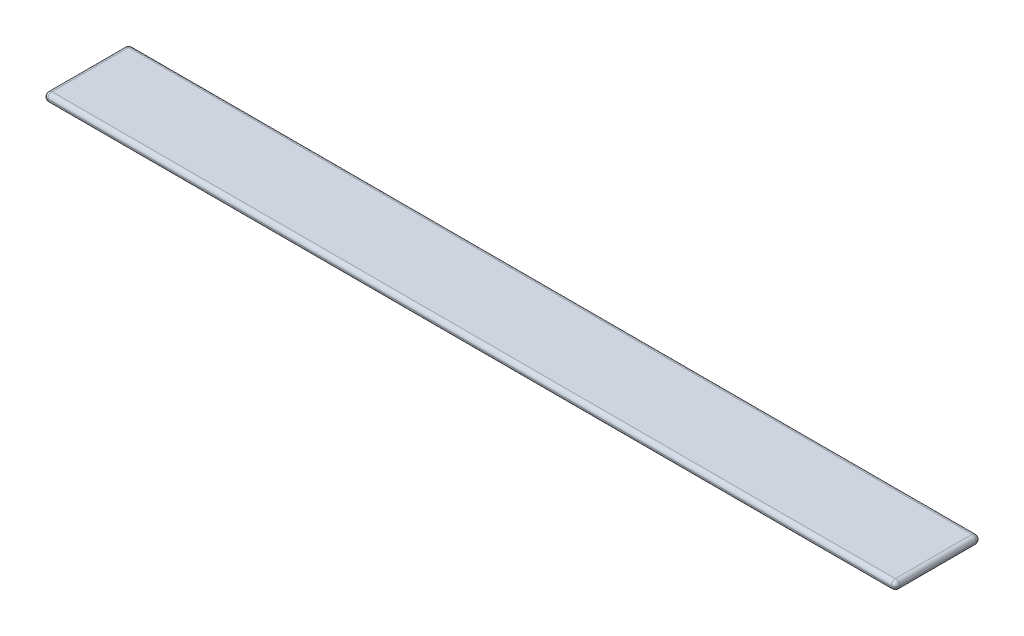
ISO-10303-21;
HEADER;
FILE_DESCRIPTION(('STEP AP214'),'2;1');
FILE_NAME('part.step','',(''),(''),'','','');
FILE_SCHEMA(('AUTOMOTIVE_DESIGN { 1 0 10303 214 1 1 1 1 }'));
ENDSEC;
DATA;
#1=APPLICATION_CONTEXT('core data for automotive mechanical design processes');
#2=APPLICATION_PROTOCOL_DEFINITION('international standard','automotive_design',2000,#1);
#3=PRODUCT_CONTEXT('',#1,'mechanical');
#4=PRODUCT('Part','Part','',(#3));
#5=PRODUCT_RELATED_PRODUCT_CATEGORY('part','',(#4));
#6=PRODUCT_DEFINITION_FORMATION('','',#4);
#7=PRODUCT_DEFINITION_CONTEXT('part definition',#1,'design');
#8=PRODUCT_DEFINITION('design','',#6,#7);
#9=PRODUCT_DEFINITION_SHAPE('','',#8);
#10=(LENGTH_UNIT() NAMED_UNIT(*) SI_UNIT(.MILLI.,.METRE.));
#11=(NAMED_UNIT(*) PLANE_ANGLE_UNIT() SI_UNIT($,.RADIAN.));
#12=(NAMED_UNIT(*) SI_UNIT($,.STERADIAN.) SOLID_ANGLE_UNIT());
#13=UNCERTAINTY_MEASURE_WITH_UNIT(LENGTH_MEASURE(1.E-05),#10,'distance_accuracy_value','');
#14=(GEOMETRIC_REPRESENTATION_CONTEXT(3) GLOBAL_UNCERTAINTY_ASSIGNED_CONTEXT((#13)) GLOBAL_UNIT_ASSIGNED_CONTEXT((#10,
#11,#12)) REPRESENTATION_CONTEXT('',''));
#15=CARTESIAN_POINT('',(0.,0.,0.));
#16=DIRECTION('',(0.,0.,1.));
#17=DIRECTION('',(1.,0.,0.));
#18=AXIS2_PLACEMENT_3D('',#15,#16,#17);
#19=CARTESIAN_POINT('',(0.,0.5,0.));
#20=DIRECTION('',(0.,1.,0.));
#21=DIRECTION('',(0.,0.,1.));
#22=AXIS2_PLACEMENT_3D('',#19,#20,#21);
#23=PLANE('',#22);
#24=DIRECTION('',(-1.,0.,0.));
#25=VECTOR('',#24,1.);
#26=CARTESIAN_POINT('',(0.,0.5,0.25));
#27=LINE('',#26,#25);
#28=CARTESIAN_POINT('',(49.75,0.5,0.25));
#29=VERTEX_POINT('',#28);
#30=CARTESIAN_POINT('',(0.25,0.5,0.25));
#31=VERTEX_POINT('',#30);
#32=EDGE_CURVE('E49',#29,#31,#27,.T.);
#33=ORIENTED_EDGE('',*,*,#32,.T.);
#34=DIRECTION('',(0.,0.,1.));
#35=VECTOR('',#34,1.);
#36=CARTESIAN_POINT('',(0.250000000000001,0.5,5.));
#37=LINE('',#36,#35);
#38=CARTESIAN_POINT('',(0.250000000000001,0.5,4.75));
#39=VERTEX_POINT('',#38);
#40=EDGE_CURVE('E11',#31,#39,#37,.T.);
#41=ORIENTED_EDGE('',*,*,#40,.T.);
#42=DIRECTION('',(1.,0.,0.));
#43=VECTOR('',#42,1.);
#44=CARTESIAN_POINT('',(50.,0.5,4.75));
#45=LINE('',#44,#43);
#46=CARTESIAN_POINT('',(49.75,0.5,4.75));
#47=VERTEX_POINT('',#46);
#48=EDGE_CURVE('E111',#39,#47,#45,.T.);
#49=ORIENTED_EDGE('',*,*,#48,.T.);
#50=DIRECTION('',(0.,0.,-1.));
#51=VECTOR('',#50,1.);
#52=CARTESIAN_POINT('',(49.75,0.5,0.));
#53=LINE('',#52,#51);
#54=EDGE_CURVE('E110',#47,#29,#53,.T.);
#55=ORIENTED_EDGE('',*,*,#54,.T.);
#56=EDGE_LOOP('',(#33,#41,#49,#55));
#57=FACE_BOUND('',#56,.T.);
#58=ADVANCED_FACE('F39',(#57),#23,.T.);
#59=CARTESIAN_POINT('',(0.,0.,0.));
#60=DIRECTION('',(0.,1.,0.));
#61=DIRECTION('',(0.,0.,1.));
#62=AXIS2_PLACEMENT_3D('',#59,#60,#61);
#63=PLANE('',#62);
#64=DIRECTION('',(1.,0.,0.));
#65=VECTOR('',#64,1.);
#66=CARTESIAN_POINT('',(0.,0.,4.75));
#67=LINE('',#66,#65);
#68=CARTESIAN_POINT('',(49.75,0.,4.75));
#69=VERTEX_POINT('',#68);
#70=CARTESIAN_POINT('',(0.250000000000001,0.,4.75));
#71=VERTEX_POINT('',#70);
#72=EDGE_CURVE('E173',#69,#71,#67,.F.);
#73=ORIENTED_EDGE('',*,*,#72,.T.);
#74=DIRECTION('',(0.,0.,1.));
#75=VECTOR('',#74,1.);
#76=CARTESIAN_POINT('',(0.25,0.,0.));
#77=LINE('',#76,#75);
#78=CARTESIAN_POINT('',(0.25,0.,0.25));
#79=VERTEX_POINT('',#78);
#80=EDGE_CURVE('E116',#71,#79,#77,.F.);
#81=ORIENTED_EDGE('',*,*,#80,.T.);
#82=DIRECTION('',(-1.,0.,0.));
#83=VECTOR('',#82,1.);
#84=CARTESIAN_POINT('',(0.,0.,0.25));
#85=LINE('',#84,#83);
#86=CARTESIAN_POINT('',(49.75,0.,0.25));
#87=VERTEX_POINT('',#86);
#88=EDGE_CURVE('E98',#79,#87,#85,.F.);
#89=ORIENTED_EDGE('',*,*,#88,.T.);
#90=DIRECTION('',(0.,0.,-1.));
#91=VECTOR('',#90,1.);
#92=CARTESIAN_POINT('',(49.75,0.,0.));
#93=LINE('',#92,#91);
#94=EDGE_CURVE('E172',#87,#69,#93,.F.);
#95=ORIENTED_EDGE('',*,*,#94,.T.);
#96=EDGE_LOOP('',(#73,#81,#89,#95));
#97=FACE_BOUND('',#96,.T.);
#98=ADVANCED_FACE('F215',(#97),#63,.F.);
#99=CARTESIAN_POINT('',(0.25,0.25,0.25));
#100=DIRECTION('',(-1.,0.,0.));
#101=DIRECTION('',(0.,0.,1.));
#102=AXIS2_PLACEMENT_3D('',#99,#100,#101);
#103=SPHERICAL_SURFACE('',#102,0.25);
#104=CARTESIAN_POINT('',(0.25,0.25,0.25));
#105=DIRECTION('',(-1.,0.,0.));
#106=DIRECTION('',(0.,0.,1.));
#107=AXIS2_PLACEMENT_3D('',#104,#105,#106);
#108=CIRCLE('',#107,0.25);
#109=CARTESIAN_POINT('',(0.25,0.25,0.));
#110=VERTEX_POINT('',#109);
#111=EDGE_CURVE('E125',#110,#31,#108,.F.);
#112=ORIENTED_EDGE('',*,*,#111,.F.);
#113=CARTESIAN_POINT('',(0.25,0.25,0.25));
#114=DIRECTION('',(0.,-1.,0.));
#115=DIRECTION('',(0.,0.,-1.));
#116=AXIS2_PLACEMENT_3D('',#113,#114,#115);
#117=CIRCLE('',#116,0.25);
#118=CARTESIAN_POINT('',(0.,0.25,0.25));
#119=VERTEX_POINT('',#118);
#120=EDGE_CURVE('E43',#119,#110,#117,.T.);
#121=ORIENTED_EDGE('',*,*,#120,.F.);
#122=CARTESIAN_POINT('',(0.25,0.25,0.25));
#123=DIRECTION('',(0.,0.,-1.));
#124=DIRECTION('',(-1.,0.,0.));
#125=AXIS2_PLACEMENT_3D('',#122,#123,#124);
#126=CIRCLE('',#125,0.25);
#127=EDGE_CURVE('E169',#31,#119,#126,.F.);
#128=ORIENTED_EDGE('',*,*,#127,.F.);
#129=EDGE_LOOP('',(#112,#121,#128));
#130=FACE_BOUND('',#129,.T.);
#131=ADVANCED_FACE('F41',(#130),#103,.T.);
#132=CARTESIAN_POINT('',(0.25,0.25,0.25));
#133=DIRECTION('',(0.,0.,-1.));
#134=DIRECTION('',(-1.,0.,0.));
#135=AXIS2_PLACEMENT_3D('',#132,#133,#134);
#136=SPHERICAL_SURFACE('',#135,0.25);
#137=CARTESIAN_POINT('',(0.25,0.25,0.25));
#138=DIRECTION('',(0.,0.,-1.));
#139=DIRECTION('',(-1.,0.,0.));
#140=AXIS2_PLACEMENT_3D('',#137,#138,#139);
#141=CIRCLE('',#140,0.25);
#142=EDGE_CURVE('E161',#119,#79,#141,.F.);
#143=ORIENTED_EDGE('',*,*,#142,.F.);
#144=ORIENTED_EDGE('',*,*,#120,.T.);
#145=CARTESIAN_POINT('',(0.25,0.25,0.25));
#146=DIRECTION('',(-1.,0.,0.));
#147=DIRECTION('',(0.,0.,1.));
#148=AXIS2_PLACEMENT_3D('',#145,#146,#147);
#149=CIRCLE('',#148,0.25);
#150=EDGE_CURVE('E164',#79,#110,#149,.F.);
#151=ORIENTED_EDGE('',*,*,#150,.F.);
#152=EDGE_LOOP('',(#143,#144,#151));
#153=FACE_BOUND('',#152,.T.);
#154=ADVANCED_FACE('F210',(#153),#136,.T.);
#155=CARTESIAN_POINT('',(0.25,0.25,0.));
#156=DIRECTION('',(0.,0.,-1.));
#157=DIRECTION('',(-1.,0.,0.));
#158=AXIS2_PLACEMENT_3D('',#155,#156,#157);
#159=CYLINDRICAL_SURFACE('',#158,0.25);
#160=ORIENTED_EDGE('',*,*,#40,.F.);
#161=ORIENTED_EDGE('',*,*,#127,.T.);
#162=DIRECTION('',(0.,0.,1.));
#163=VECTOR('',#162,1.);
#164=CARTESIAN_POINT('',(0.,0.25,0.));
#165=LINE('',#164,#163);
#166=CARTESIAN_POINT('',(0.,0.25,4.75));
#167=VERTEX_POINT('',#166);
#168=EDGE_CURVE('E158',#167,#119,#165,.F.);
#169=ORIENTED_EDGE('',*,*,#168,.F.);
#170=CARTESIAN_POINT('',(0.250000000000001,0.25,4.75));
#171=DIRECTION('',(0.,0.,1.));
#172=DIRECTION('',(1.,0.,0.));
#173=AXIS2_PLACEMENT_3D('',#170,#171,#172);
#174=CIRCLE('',#173,0.25);
#175=EDGE_CURVE('E133',#39,#167,#174,.T.);
#176=ORIENTED_EDGE('',*,*,#175,.F.);
#177=EDGE_LOOP('',(#160,#161,#169,#176));
#178=FACE_BOUND('',#177,.T.);
#179=ADVANCED_FACE('F233',(#178),#159,.T.);
#180=CARTESIAN_POINT('',(0.,0.25,0.25));
#181=DIRECTION('',(1.,0.,0.));
#182=DIRECTION('',(0.,0.,-1.));
#183=AXIS2_PLACEMENT_3D('',#180,#181,#182);
#184=CYLINDRICAL_SURFACE('',#183,0.25);
#185=CARTESIAN_POINT('',(49.75,0.25,0.25));
#186=DIRECTION('',(1.,0.,0.));
#187=DIRECTION('',(0.,0.,-1.));
#188=AXIS2_PLACEMENT_3D('',#185,#186,#187);
#189=CIRCLE('',#188,0.25);
#190=CARTESIAN_POINT('',(49.75,0.25,0.));
#191=VERTEX_POINT('',#190);
#192=EDGE_CURVE('E123',#191,#29,#189,.T.);
#193=ORIENTED_EDGE('',*,*,#192,.F.);
#194=DIRECTION('',(-1.,0.,0.));
#195=VECTOR('',#194,1.);
#196=CARTESIAN_POINT('',(50.,0.25,0.));
#197=LINE('',#196,#195);
#198=EDGE_CURVE('E167',#110,#191,#197,.F.);
#199=ORIENTED_EDGE('',*,*,#198,.F.);
#200=ORIENTED_EDGE('',*,*,#111,.T.);
#201=ORIENTED_EDGE('',*,*,#32,.F.);
#202=EDGE_LOOP('',(#193,#199,#200,#201));
#203=FACE_BOUND('',#202,.T.);
#204=ADVANCED_FACE('F121',(#203),#184,.T.);
#205=CARTESIAN_POINT('',(0.,0.25,0.25));
#206=DIRECTION('',(-1.,0.,0.));
#207=DIRECTION('',(0.,0.,1.));
#208=AXIS2_PLACEMENT_3D('',#205,#206,#207);
#209=CYLINDRICAL_SURFACE('',#208,0.25);
#210=ORIENTED_EDGE('',*,*,#150,.T.);
#211=ORIENTED_EDGE('',*,*,#198,.T.);
#212=CARTESIAN_POINT('',(49.75,0.25,0.25));
#213=DIRECTION('',(1.,0.,0.));
#214=DIRECTION('',(0.,0.,-1.));
#215=AXIS2_PLACEMENT_3D('',#212,#213,#214);
#216=CIRCLE('',#215,0.25);
#217=EDGE_CURVE('E152',#87,#191,#216,.T.);
#218=ORIENTED_EDGE('',*,*,#217,.F.);
#219=ORIENTED_EDGE('',*,*,#88,.F.);
#220=EDGE_LOOP('',(#210,#211,#218,#219));
#221=FACE_BOUND('',#220,.T.);
#222=ADVANCED_FACE('F209',(#221),#209,.T.);
#223=CARTESIAN_POINT('',(0.25,0.25,0.));
#224=DIRECTION('',(0.,0.,1.));
#225=DIRECTION('',(1.,0.,0.));
#226=AXIS2_PLACEMENT_3D('',#223,#224,#225);
#227=CYLINDRICAL_SURFACE('',#226,0.25);
#228=CARTESIAN_POINT('',(0.250000000000001,0.25,4.75));
#229=DIRECTION('',(0.,0.,1.));
#230=DIRECTION('',(1.,0.,0.));
#231=AXIS2_PLACEMENT_3D('',#228,#229,#230);
#232=CIRCLE('',#231,0.25);
#233=EDGE_CURVE('E149',#167,#71,#232,.T.);
#234=ORIENTED_EDGE('',*,*,#233,.F.);
#235=ORIENTED_EDGE('',*,*,#168,.T.);
#236=ORIENTED_EDGE('',*,*,#142,.T.);
#237=ORIENTED_EDGE('',*,*,#80,.F.);
#238=EDGE_LOOP('',(#234,#235,#236,#237));
#239=FACE_BOUND('',#238,.T.);
#240=ADVANCED_FACE('F214',(#239),#227,.T.);
#241=CARTESIAN_POINT('',(0.250000000000001,0.25,4.75));
#242=DIRECTION('',(-1.,0.,0.));
#243=DIRECTION('',(0.,0.,1.));
#244=AXIS2_PLACEMENT_3D('',#241,#242,#243);
#245=SPHERICAL_SURFACE('',#244,0.25);
#246=ORIENTED_EDGE('',*,*,#175,.T.);
#247=CARTESIAN_POINT('',(0.250000000000001,0.25,4.75));
#248=DIRECTION('',(0.,-1.,0.));
#249=DIRECTION('',(0.,0.,-1.));
#250=AXIS2_PLACEMENT_3D('',#247,#248,#249);
#251=CIRCLE('',#250,0.25);
#252=CARTESIAN_POINT('',(0.250000000000001,0.25,5.));
#253=VERTEX_POINT('',#252);
#254=EDGE_CURVE('E141',#253,#167,#251,.T.);
#255=ORIENTED_EDGE('',*,*,#254,.F.);
#256=CARTESIAN_POINT('',(0.250000000000001,0.25,4.75));
#257=DIRECTION('',(-1.,0.,0.));
#258=DIRECTION('',(0.,-1.,0.));
#259=AXIS2_PLACEMENT_3D('',#256,#257,#258);
#260=CIRCLE('',#259,0.25);
#261=EDGE_CURVE('E138',#39,#253,#260,.F.);
#262=ORIENTED_EDGE('',*,*,#261,.F.);
#263=EDGE_LOOP('',(#246,#255,#262));
#264=FACE_BOUND('',#263,.T.);
#265=ADVANCED_FACE('F232',(#264),#245,.T.);
#266=CARTESIAN_POINT('',(49.75,0.25,0.25));
#267=DIRECTION('',(0.,0.,-1.));
#268=DIRECTION('',(-1.,0.,0.));
#269=AXIS2_PLACEMENT_3D('',#266,#267,#268);
#270=SPHERICAL_SURFACE('',#269,0.25);
#271=CARTESIAN_POINT('',(49.75,0.25,0.25));
#272=DIRECTION('',(0.,1.,0.));
#273=DIRECTION('',(0.,0.,1.));
#274=AXIS2_PLACEMENT_3D('',#271,#272,#273);
#275=CIRCLE('',#274,0.25);
#276=CARTESIAN_POINT('',(50.,0.25,0.25));
#277=VERTEX_POINT('',#276);
#278=EDGE_CURVE('E132',#277,#191,#275,.T.);
#279=ORIENTED_EDGE('',*,*,#278,.T.);
#280=ORIENTED_EDGE('',*,*,#192,.T.);
#281=CARTESIAN_POINT('',(49.75,0.25,0.25));
#282=DIRECTION('',(0.,0.,-1.));
#283=DIRECTION('',(-1.,0.,0.));
#284=AXIS2_PLACEMENT_3D('',#281,#282,#283);
#285=CIRCLE('',#284,0.25);
#286=EDGE_CURVE('E130',#277,#29,#285,.F.);
#287=ORIENTED_EDGE('',*,*,#286,.F.);
#288=EDGE_LOOP('',(#279,#280,#287));
#289=FACE_BOUND('',#288,.T.);
#290=ADVANCED_FACE('F129',(#289),#270,.T.);
#291=CARTESIAN_POINT('',(49.75,0.25,0.25));
#292=DIRECTION('',(0.,0.,-1.));
#293=DIRECTION('',(-1.,0.,0.));
#294=AXIS2_PLACEMENT_3D('',#291,#292,#293);
#295=SPHERICAL_SURFACE('',#294,0.25);
#296=ORIENTED_EDGE('',*,*,#217,.T.);
#297=ORIENTED_EDGE('',*,*,#278,.F.);
#298=CARTESIAN_POINT('',(49.75,0.25,0.25));
#299=DIRECTION('',(0.,0.,-1.));
#300=DIRECTION('',(-1.,0.,0.));
#301=AXIS2_PLACEMENT_3D('',#298,#299,#300);
#302=CIRCLE('',#301,0.25);
#303=EDGE_CURVE('E143',#87,#277,#302,.F.);
#304=ORIENTED_EDGE('',*,*,#303,.F.);
#305=EDGE_LOOP('',(#296,#297,#304));
#306=FACE_BOUND('',#305,.T.);
#307=ADVANCED_FACE('F207',(#306),#295,.T.);
#308=CARTESIAN_POINT('',(0.250000000000001,0.25,4.75));
#309=DIRECTION('',(-1.,0.,0.));
#310=DIRECTION('',(0.,0.,1.));
#311=AXIS2_PLACEMENT_3D('',#308,#309,#310);
#312=SPHERICAL_SURFACE('',#311,0.25);
#313=ORIENTED_EDGE('',*,*,#254,.T.);
#314=ORIENTED_EDGE('',*,*,#233,.T.);
#315=CARTESIAN_POINT('',(0.250000000000001,0.25,4.75));
#316=DIRECTION('',(-1.,0.,0.));
#317=DIRECTION('',(0.,0.,1.));
#318=AXIS2_PLACEMENT_3D('',#315,#316,#317);
#319=CIRCLE('',#318,0.25);
#320=EDGE_CURVE('E200',#253,#71,#319,.F.);
#321=ORIENTED_EDGE('',*,*,#320,.F.);
#322=EDGE_LOOP('',(#313,#314,#321));
#323=FACE_BOUND('',#322,.T.);
#324=ADVANCED_FACE('F231',(#323),#312,.T.);
#325=CARTESIAN_POINT('',(0.,0.25,4.75));
#326=DIRECTION('',(-1.,0.,0.));
#327=DIRECTION('',(0.,0.,1.));
#328=AXIS2_PLACEMENT_3D('',#325,#326,#327);
#329=CYLINDRICAL_SURFACE('',#328,0.25);
#330=ORIENTED_EDGE('',*,*,#48,.F.);
#331=ORIENTED_EDGE('',*,*,#261,.T.);
#332=DIRECTION('',(1.,0.,0.));
#333=VECTOR('',#332,1.);
#334=CARTESIAN_POINT('',(0.,0.25,5.));
#335=LINE('',#334,#333);
#336=CARTESIAN_POINT('',(49.75,0.25,5.));
#337=VERTEX_POINT('',#336);
#338=EDGE_CURVE('E197',#337,#253,#335,.F.);
#339=ORIENTED_EDGE('',*,*,#338,.F.);
#340=CARTESIAN_POINT('',(49.75,0.25,4.75));
#341=DIRECTION('',(1.,0.,0.));
#342=DIRECTION('',(0.,0.,-1.));
#343=AXIS2_PLACEMENT_3D('',#340,#341,#342);
#344=CIRCLE('',#343,0.25);
#345=EDGE_CURVE('E194',#47,#337,#344,.T.);
#346=ORIENTED_EDGE('',*,*,#345,.F.);
#347=EDGE_LOOP('',(#330,#331,#339,#346));
#348=FACE_BOUND('',#347,.T.);
#349=ADVANCED_FACE('F226',(#348),#329,.T.);
#350=CARTESIAN_POINT('',(49.75,0.25,0.));
#351=DIRECTION('',(0.,0.,1.));
#352=DIRECTION('',(1.,0.,0.));
#353=AXIS2_PLACEMENT_3D('',#350,#351,#352);
#354=CYLINDRICAL_SURFACE('',#353,0.25);
#355=DIRECTION('',(0.,0.,-1.));
#356=VECTOR('',#355,1.);
#357=CARTESIAN_POINT('',(50.,0.25,5.));
#358=LINE('',#357,#356);
#359=CARTESIAN_POINT('',(50.,0.25,4.75));
#360=VERTEX_POINT('',#359);
#361=EDGE_CURVE('E136',#277,#360,#358,.F.);
#362=ORIENTED_EDGE('',*,*,#361,.F.);
#363=ORIENTED_EDGE('',*,*,#286,.T.);
#364=ORIENTED_EDGE('',*,*,#54,.F.);
#365=CARTESIAN_POINT('',(49.75,0.25,4.75));
#366=DIRECTION('',(0.,0.,1.));
#367=DIRECTION('',(1.,0.,0.));
#368=AXIS2_PLACEMENT_3D('',#365,#366,#367);
#369=CIRCLE('',#368,0.25);
#370=EDGE_CURVE('E191',#360,#47,#369,.T.);
#371=ORIENTED_EDGE('',*,*,#370,.F.);
#372=EDGE_LOOP('',(#362,#363,#364,#371));
#373=FACE_BOUND('',#372,.T.);
#374=ADVANCED_FACE('F135',(#373),#354,.T.);
#375=CARTESIAN_POINT('',(49.75,0.25,0.));
#376=DIRECTION('',(0.,0.,-1.));
#377=DIRECTION('',(-1.,0.,0.));
#378=AXIS2_PLACEMENT_3D('',#375,#376,#377);
#379=CYLINDRICAL_SURFACE('',#378,0.25);
#380=ORIENTED_EDGE('',*,*,#303,.T.);
#381=ORIENTED_EDGE('',*,*,#361,.T.);
#382=CARTESIAN_POINT('',(49.75,0.25,4.75));
#383=DIRECTION('',(0.,0.,1.));
#384=DIRECTION('',(1.,0.,0.));
#385=AXIS2_PLACEMENT_3D('',#382,#383,#384);
#386=CIRCLE('',#385,0.25);
#387=EDGE_CURVE('E188',#69,#360,#386,.T.);
#388=ORIENTED_EDGE('',*,*,#387,.F.);
#389=ORIENTED_EDGE('',*,*,#94,.F.);
#390=EDGE_LOOP('',(#380,#381,#388,#389));
#391=FACE_BOUND('',#390,.T.);
#392=ADVANCED_FACE('F204',(#391),#379,.T.);
#393=CARTESIAN_POINT('',(0.,0.25,4.75));
#394=DIRECTION('',(1.,0.,0.));
#395=DIRECTION('',(0.,0.,-1.));
#396=AXIS2_PLACEMENT_3D('',#393,#394,#395);
#397=CYLINDRICAL_SURFACE('',#396,0.25);
#398=ORIENTED_EDGE('',*,*,#320,.T.);
#399=ORIENTED_EDGE('',*,*,#72,.F.);
#400=CARTESIAN_POINT('',(49.75,0.25,4.75));
#401=DIRECTION('',(1.,0.,0.));
#402=DIRECTION('',(0.,0.,-1.));
#403=AXIS2_PLACEMENT_3D('',#400,#401,#402);
#404=CIRCLE('',#403,0.25);
#405=EDGE_CURVE('E185',#337,#69,#404,.T.);
#406=ORIENTED_EDGE('',*,*,#405,.F.);
#407=ORIENTED_EDGE('',*,*,#338,.T.);
#408=EDGE_LOOP('',(#398,#399,#406,#407));
#409=FACE_BOUND('',#408,.T.);
#410=ADVANCED_FACE('F218',(#409),#397,.T.);
#411=CARTESIAN_POINT('',(49.75,0.25,4.75));
#412=DIRECTION('',(0.,1.,0.));
#413=DIRECTION('',(0.,0.,1.));
#414=AXIS2_PLACEMENT_3D('',#411,#412,#413);
#415=SPHERICAL_SURFACE('',#414,0.25);
#416=ORIENTED_EDGE('',*,*,#370,.T.);
#417=ORIENTED_EDGE('',*,*,#345,.T.);
#418=CARTESIAN_POINT('',(49.75,0.25,4.75));
#419=DIRECTION('',(0.,1.,0.));
#420=DIRECTION('',(0.,0.,1.));
#421=AXIS2_PLACEMENT_3D('',#418,#419,#420);
#422=CIRCLE('',#421,0.25);
#423=EDGE_CURVE('E182',#360,#337,#422,.F.);
#424=ORIENTED_EDGE('',*,*,#423,.F.);
#425=EDGE_LOOP('',(#416,#417,#424));
#426=FACE_BOUND('',#425,.T.);
#427=ADVANCED_FACE('F224',(#426),#415,.T.);
#428=CARTESIAN_POINT('',(49.75,0.25,4.75));
#429=DIRECTION('',(0.,-1.,0.));
#430=DIRECTION('',(0.,0.,-1.));
#431=AXIS2_PLACEMENT_3D('',#428,#429,#430);
#432=SPHERICAL_SURFACE('',#431,0.25);
#433=ORIENTED_EDGE('',*,*,#405,.T.);
#434=ORIENTED_EDGE('',*,*,#387,.T.);
#435=ORIENTED_EDGE('',*,*,#423,.T.);
#436=EDGE_LOOP('',(#433,#434,#435));
#437=FACE_BOUND('',#436,.T.);
#438=ADVANCED_FACE('F222',(#437),#432,.T.);
#439=CLOSED_SHELL('',(#58,#98,#131,#154,#179,#204,#222,#240,#265,#290,#307,#324,#349,#374,#392,
#410,#427,#438));
#440=MANIFOLD_SOLID_BREP('B2',#439);
#441=ADVANCED_BREP_SHAPE_REPRESENTATION('',(#18,#440),#14);
#442=SHAPE_DEFINITION_REPRESENTATION(#9,#441);
ENDSEC;
END-ISO-10303-21;
